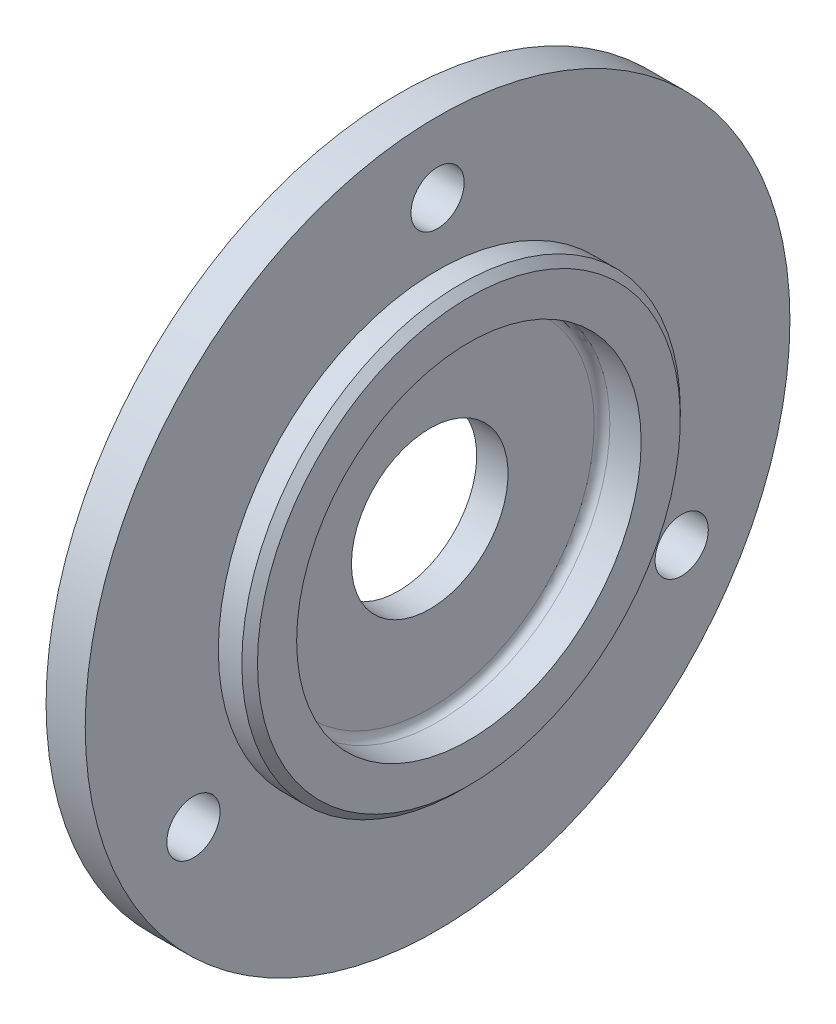
ISO-10303-21;
HEADER;
FILE_DESCRIPTION(('STEP AP214'),'2;1');
FILE_NAME('part.step','',(''),(''),'','','');
FILE_SCHEMA(('AUTOMOTIVE_DESIGN { 1 0 10303 214 1 1 1 1 }'));
ENDSEC;
DATA;
#1=APPLICATION_CONTEXT('core data for automotive mechanical design processes');
#2=APPLICATION_PROTOCOL_DEFINITION('international standard','automotive_design',2000,#1);
#3=PRODUCT_CONTEXT('',#1,'mechanical');
#4=PRODUCT('Part','Part','',(#3));
#5=PRODUCT_RELATED_PRODUCT_CATEGORY('part','',(#4));
#6=PRODUCT_DEFINITION_FORMATION('','',#4);
#7=PRODUCT_DEFINITION_CONTEXT('part definition',#1,'design');
#8=PRODUCT_DEFINITION('design','',#6,#7);
#9=PRODUCT_DEFINITION_SHAPE('','',#8);
#10=(LENGTH_UNIT() NAMED_UNIT(*) SI_UNIT(.MILLI.,.METRE.));
#11=(NAMED_UNIT(*) PLANE_ANGLE_UNIT() SI_UNIT($,.RADIAN.));
#12=(NAMED_UNIT(*) SI_UNIT($,.STERADIAN.) SOLID_ANGLE_UNIT());
#13=UNCERTAINTY_MEASURE_WITH_UNIT(LENGTH_MEASURE(1.E-05),#10,'distance_accuracy_value','');
#14=(GEOMETRIC_REPRESENTATION_CONTEXT(3) GLOBAL_UNCERTAINTY_ASSIGNED_CONTEXT((#13)) GLOBAL_UNIT_ASSIGNED_CONTEXT((#10,
#11,#12)) REPRESENTATION_CONTEXT('',''));
#15=CARTESIAN_POINT('',(0.,0.,0.));
#16=DIRECTION('',(0.,0.,1.));
#17=DIRECTION('',(1.,0.,0.));
#18=AXIS2_PLACEMENT_3D('',#15,#16,#17);
#19=CARTESIAN_POINT('',(-14.777796327212,-1.11022302462516E-13,0.));
#20=DIRECTION('',(-1.,0.,0.));
#21=DIRECTION('',(0.,0.,1.));
#22=AXIS2_PLACEMENT_3D('',#19,#20,#21);
#23=CYLINDRICAL_SURFACE('',#22,5.);
#24=CARTESIAN_POINT('',(-0.5,-1.11022302462516E-13,0.));
#25=DIRECTION('',(-1.,0.,0.));
#26=DIRECTION('',(0.,0.,1.));
#27=AXIS2_PLACEMENT_3D('',#24,#25,#26);
#28=CIRCLE('',#27,5.);
#29=CARTESIAN_POINT('',(-0.5,-1.11577413974828E-13,4.99999999999999));
#30=VERTEX_POINT('',#29);
#31=EDGE_CURVE('E66',#30,#30,#28,.T.);
#32=ORIENTED_EDGE('',*,*,#31,.F.);
#33=EDGE_LOOP('',(#32));
#34=FACE_BOUND('',#33,.T.);
#35=CARTESIAN_POINT('',(-2.5,-1.11022302462516E-13,0.));
#36=DIRECTION('',(-1.,0.,0.));
#37=DIRECTION('',(0.,0.,1.));
#38=AXIS2_PLACEMENT_3D('',#35,#36,#37);
#39=CIRCLE('',#38,5.);
#40=CARTESIAN_POINT('',(-2.5,-1.11577413974828E-13,4.99999999999999));
#41=VERTEX_POINT('',#40);
#42=EDGE_CURVE('E10',#41,#41,#39,.T.);
#43=ORIENTED_EDGE('',*,*,#42,.T.);
#44=EDGE_LOOP('',(#43));
#45=FACE_BOUND('',#44,.T.);
#46=ADVANCED_FACE('F32',(#34,#45),#23,.F.);
#47=CARTESIAN_POINT('',(-2.5,22.5,0.));
#48=DIRECTION('',(1.,0.,0.));
#49=DIRECTION('',(0.,0.,-1.));
#50=AXIS2_PLACEMENT_3D('',#47,#48,#49);
#51=PLANE('',#50);
#52=CARTESIAN_POINT('',(-2.5,-8.99999999999979,15.58845726812));
#53=DIRECTION('',(1.,0.,0.));
#54=DIRECTION('',(0.,0.,-1.));
#55=AXIS2_PLACEMENT_3D('',#52,#53,#54);
#56=CIRCLE('',#55,1.7);
#57=CARTESIAN_POINT('',(-2.5,-8.99999999999979,13.88845726812));
#58=VERTEX_POINT('',#57);
#59=EDGE_CURVE('E81',#58,#58,#56,.T.);
#60=ORIENTED_EDGE('',*,*,#59,.T.);
#61=EDGE_LOOP('',(#60));
#62=FACE_BOUND('',#61,.T.);
#63=CARTESIAN_POINT('',(-2.5,-9.00000000000001,-15.5884572681199));
#64=DIRECTION('',(1.,0.,0.));
#65=DIRECTION('',(0.,0.,-1.));
#66=AXIS2_PLACEMENT_3D('',#63,#64,#65);
#67=CIRCLE('',#66,1.7);
#68=CARTESIAN_POINT('',(-2.5,-9.00000000000001,-17.2884572681199));
#69=VERTEX_POINT('',#68);
#70=EDGE_CURVE('E75',#69,#69,#67,.T.);
#71=ORIENTED_EDGE('',*,*,#70,.T.);
#72=EDGE_LOOP('',(#71));
#73=FACE_BOUND('',#72,.T.);
#74=CARTESIAN_POINT('',(-2.5,18.,0.));
#75=DIRECTION('',(1.,0.,0.));
#76=DIRECTION('',(0.,0.,-1.));
#77=AXIS2_PLACEMENT_3D('',#74,#75,#76);
#78=CIRCLE('',#77,1.7);
#79=CARTESIAN_POINT('',(-2.5,18.,-1.70000000000003));
#80=VERTEX_POINT('',#79);
#81=EDGE_CURVE('E69',#80,#80,#78,.T.);
#82=ORIENTED_EDGE('',*,*,#81,.T.);
#83=EDGE_LOOP('',(#82));
#84=FACE_BOUND('',#83,.T.);
#85=ORIENTED_EDGE('',*,*,#42,.F.);
#86=EDGE_LOOP('',(#85));
#87=FACE_BOUND('',#86,.T.);
#88=CARTESIAN_POINT('',(-2.5,-1.11022302462516E-13,0.));
#89=DIRECTION('',(-1.,0.,0.));
#90=DIRECTION('',(0.,0.,1.));
#91=AXIS2_PLACEMENT_3D('',#88,#89,#90);
#92=CIRCLE('',#91,22.5);
#93=CARTESIAN_POINT('',(-2.5,-1.13520304267922E-13,22.5));
#94=VERTEX_POINT('',#93);
#95=EDGE_CURVE('E38',#94,#94,#92,.T.);
#96=ORIENTED_EDGE('',*,*,#95,.T.);
#97=EDGE_LOOP('',(#96));
#98=FACE_BOUND('',#97,.T.);
#99=ADVANCED_FACE('F142',(#62,#73,#84,#87,#98),#51,.F.);
#100=CARTESIAN_POINT('',(-14.777796327212,-1.11022302462516E-13,0.));
#101=DIRECTION('',(-1.,0.,0.));
#102=DIRECTION('',(0.,0.,1.));
#103=AXIS2_PLACEMENT_3D('',#100,#101,#102);
#104=CYLINDRICAL_SURFACE('',#103,22.5);
#105=ORIENTED_EDGE('',*,*,#95,.F.);
#106=EDGE_LOOP('',(#105));
#107=FACE_BOUND('',#106,.T.);
#108=CARTESIAN_POINT('',(0.,-1.11022302462516E-13,0.));
#109=DIRECTION('',(-1.,0.,0.));
#110=DIRECTION('',(0.,0.,1.));
#111=AXIS2_PLACEMENT_3D('',#108,#109,#110);
#112=CIRCLE('',#111,22.5);
#113=CARTESIAN_POINT('',(0.,-1.13520304267922E-13,22.5));
#114=VERTEX_POINT('',#113);
#115=EDGE_CURVE('E42',#114,#114,#112,.T.);
#116=ORIENTED_EDGE('',*,*,#115,.T.);
#117=EDGE_LOOP('',(#116));
#118=FACE_BOUND('',#117,.T.);
#119=ADVANCED_FACE('F95',(#107,#118),#104,.T.);
#120=CARTESIAN_POINT('',(0.,14.0000000000001,0.));
#121=DIRECTION('',(-1.,0.,0.));
#122=DIRECTION('',(0.,0.,1.));
#123=AXIS2_PLACEMENT_3D('',#120,#121,#122);
#124=PLANE('',#123);
#125=CARTESIAN_POINT('',(0.,-8.99999999999995,15.5884572681199));
#126=DIRECTION('',(1.,0.,0.));
#127=DIRECTION('',(0.,0.,-1.));
#128=AXIS2_PLACEMENT_3D('',#125,#126,#127);
#129=CIRCLE('',#128,1.7);
#130=CARTESIAN_POINT('',(0.,-8.99999999999995,13.8884572681199));
#131=VERTEX_POINT('',#130);
#132=EDGE_CURVE('E84',#131,#131,#129,.T.);
#133=ORIENTED_EDGE('',*,*,#132,.F.);
#134=EDGE_LOOP('',(#133));
#135=FACE_BOUND('',#134,.T.);
#136=CARTESIAN_POINT('',(0.,-9.00000000000001,-15.5884572681199));
#137=DIRECTION('',(1.,0.,0.));
#138=DIRECTION('',(0.,0.,-1.));
#139=AXIS2_PLACEMENT_3D('',#136,#137,#138);
#140=CIRCLE('',#139,1.7);
#141=CARTESIAN_POINT('',(0.,-9.00000000000001,-17.2884572681199));
#142=VERTEX_POINT('',#141);
#143=EDGE_CURVE('E78',#142,#142,#140,.T.);
#144=ORIENTED_EDGE('',*,*,#143,.F.);
#145=EDGE_LOOP('',(#144));
#146=FACE_BOUND('',#145,.T.);
#147=CARTESIAN_POINT('',(0.,18.,0.));
#148=DIRECTION('',(1.,0.,0.));
#149=DIRECTION('',(0.,0.,-1.));
#150=AXIS2_PLACEMENT_3D('',#147,#148,#149);
#151=CIRCLE('',#150,1.7);
#152=CARTESIAN_POINT('',(0.,18.,-1.70000000000003));
#153=VERTEX_POINT('',#152);
#154=EDGE_CURVE('E72',#153,#153,#151,.T.);
#155=ORIENTED_EDGE('',*,*,#154,.F.);
#156=EDGE_LOOP('',(#155));
#157=FACE_BOUND('',#156,.T.);
#158=ORIENTED_EDGE('',*,*,#115,.F.);
#159=EDGE_LOOP('',(#158));
#160=FACE_BOUND('',#159,.T.);
#161=CARTESIAN_POINT('',(0.,-1.11022302462516E-13,0.));
#162=DIRECTION('',(-1.,0.,0.));
#163=DIRECTION('',(0.,0.,1.));
#164=AXIS2_PLACEMENT_3D('',#161,#162,#163);
#165=CIRCLE('',#164,14.);
#166=CARTESIAN_POINT('',(0.,-1.12576614696991E-13,14.));
#167=VERTEX_POINT('',#166);
#168=EDGE_CURVE('E46',#167,#167,#165,.T.);
#169=ORIENTED_EDGE('',*,*,#168,.T.);
#170=EDGE_LOOP('',(#169));
#171=FACE_BOUND('',#170,.T.);
#172=ADVANCED_FACE('F91',(#135,#146,#157,#160,#171),#124,.F.);
#173=CARTESIAN_POINT('',(-14.777796327212,-1.11022302462516E-13,0.));
#174=DIRECTION('',(-1.,0.,0.));
#175=DIRECTION('',(0.,0.,1.));
#176=AXIS2_PLACEMENT_3D('',#173,#174,#175);
#177=CYLINDRICAL_SURFACE('',#176,14.);
#178=ORIENTED_EDGE('',*,*,#168,.F.);
#179=EDGE_LOOP('',(#178));
#180=FACE_BOUND('',#179,.T.);
#181=CARTESIAN_POINT('',(1.5,-1.11022302462516E-13,0.));
#182=DIRECTION('',(-1.,0.,0.));
#183=DIRECTION('',(0.,0.,1.));
#184=AXIS2_PLACEMENT_3D('',#181,#182,#183);
#185=CIRCLE('',#184,14.);
#186=CARTESIAN_POINT('',(1.5,-1.12576614696991E-13,14.));
#187=VERTEX_POINT('',#186);
#188=EDGE_CURVE('E51',#187,#187,#185,.T.);
#189=ORIENTED_EDGE('',*,*,#188,.T.);
#190=EDGE_LOOP('',(#189));
#191=FACE_BOUND('',#190,.T.);
#192=ADVANCED_FACE('F94',(#180,#191),#177,.T.);
#193=CARTESIAN_POINT('',(2.,-1.11022302462516E-13,0.));
#194=DIRECTION('',(-1.,0.,0.));
#195=DIRECTION('',(0.,0.,1.));
#196=AXIS2_PLACEMENT_3D('',#193,#194,#195);
#197=CONICAL_SURFACE('',#196,13.5,0.785398163397447);
#198=ORIENTED_EDGE('',*,*,#188,.F.);
#199=EDGE_LOOP('',(#198));
#200=FACE_BOUND('',#199,.T.);
#201=CARTESIAN_POINT('',(2.,-1.11022302462516E-13,0.));
#202=DIRECTION('',(-1.,0.,0.));
#203=DIRECTION('',(0.,0.,1.));
#204=AXIS2_PLACEMENT_3D('',#201,#202,#203);
#205=CIRCLE('',#204,13.5);
#206=CARTESIAN_POINT('',(2.,-1.1252110354576E-13,13.5));
#207=VERTEX_POINT('',#206);
#208=EDGE_CURVE('E54',#207,#207,#205,.T.);
#209=ORIENTED_EDGE('',*,*,#208,.T.);
#210=EDGE_LOOP('',(#209));
#211=FACE_BOUND('',#210,.T.);
#212=ADVANCED_FACE('F107',(#200,#211),#197,.T.);
#213=CARTESIAN_POINT('',(2.,11.,0.));
#214=DIRECTION('',(-1.,0.,0.));
#215=DIRECTION('',(0.,0.,1.));
#216=AXIS2_PLACEMENT_3D('',#213,#214,#215);
#217=PLANE('',#216);
#218=ORIENTED_EDGE('',*,*,#208,.F.);
#219=EDGE_LOOP('',(#218));
#220=FACE_BOUND('',#219,.T.);
#221=CARTESIAN_POINT('',(2.,-1.11022302462516E-13,0.));
#222=DIRECTION('',(-1.,0.,0.));
#223=DIRECTION('',(0.,0.,1.));
#224=AXIS2_PLACEMENT_3D('',#221,#222,#223);
#225=CIRCLE('',#224,11.);
#226=CARTESIAN_POINT('',(2.,-1.12243547789603E-13,11.));
#227=VERTEX_POINT('',#226);
#228=EDGE_CURVE('E57',#227,#227,#225,.T.);
#229=ORIENTED_EDGE('',*,*,#228,.T.);
#230=EDGE_LOOP('',(#229));
#231=FACE_BOUND('',#230,.T.);
#232=ADVANCED_FACE('F113',(#220,#231),#217,.F.);
#233=CARTESIAN_POINT('',(-14.777796327212,-1.11022302462516E-13,0.));
#234=DIRECTION('',(-1.,0.,0.));
#235=DIRECTION('',(0.,0.,1.));
#236=AXIS2_PLACEMENT_3D('',#233,#234,#235);
#237=CYLINDRICAL_SURFACE('',#236,11.);
#238=ORIENTED_EDGE('',*,*,#228,.F.);
#239=EDGE_LOOP('',(#238));
#240=FACE_BOUND('',#239,.T.);
#241=CARTESIAN_POINT('',(0.,-1.11022302462516E-13,0.));
#242=DIRECTION('',(-1.,0.,0.));
#243=DIRECTION('',(0.,0.,1.));
#244=AXIS2_PLACEMENT_3D('',#241,#242,#243);
#245=CIRCLE('',#244,11.);
#246=CARTESIAN_POINT('',(0.,-1.12243547789603E-13,11.));
#247=VERTEX_POINT('',#246);
#248=EDGE_CURVE('E60',#247,#247,#245,.T.);
#249=ORIENTED_EDGE('',*,*,#248,.T.);
#250=EDGE_LOOP('',(#249));
#251=FACE_BOUND('',#250,.T.);
#252=ADVANCED_FACE('F119',(#240,#251),#237,.F.);
#253=CARTESIAN_POINT('',(0.,-1.11022302462516E-13,0.));
#254=DIRECTION('',(-1.,0.,0.));
#255=DIRECTION('',(0.,0.,1.));
#256=AXIS2_PLACEMENT_3D('',#253,#254,#255);
#257=TOROIDAL_SURFACE('',#256,10.5,0.5);
#258=ORIENTED_EDGE('',*,*,#248,.F.);
#259=EDGE_LOOP('',(#258));
#260=FACE_BOUND('',#259,.T.);
#261=CARTESIAN_POINT('',(-0.5,-1.11022302462516E-13,0.));
#262=DIRECTION('',(-1.,0.,0.));
#263=DIRECTION('',(0.,0.,1.));
#264=AXIS2_PLACEMENT_3D('',#261,#262,#263);
#265=CIRCLE('',#264,10.5);
#266=CARTESIAN_POINT('',(-0.5,-1.12188036638372E-13,10.5));
#267=VERTEX_POINT('',#266);
#268=EDGE_CURVE('E63',#267,#267,#265,.T.);
#269=ORIENTED_EDGE('',*,*,#268,.T.);
#270=EDGE_LOOP('',(#269));
#271=FACE_BOUND('',#270,.T.);
#272=ADVANCED_FACE('F125',(#260,#271),#257,.F.);
#273=CARTESIAN_POINT('',(-0.500000000000002,5.00000000000014,0.));
#274=DIRECTION('',(-1.,0.,0.));
#275=DIRECTION('',(0.,0.,1.));
#276=AXIS2_PLACEMENT_3D('',#273,#274,#275);
#277=PLANE('',#276);
#278=ORIENTED_EDGE('',*,*,#268,.F.);
#279=EDGE_LOOP('',(#278));
#280=FACE_BOUND('',#279,.T.);
#281=ORIENTED_EDGE('',*,*,#31,.T.);
#282=EDGE_LOOP('',(#281));
#283=FACE_BOUND('',#282,.T.);
#284=ADVANCED_FACE('F131',(#280,#283),#277,.F.);
#285=CARTESIAN_POINT('',(-9.99999999999998,18.,0.));
#286=DIRECTION('',(1.,0.,0.));
#287=DIRECTION('',(0.,0.,-1.));
#288=AXIS2_PLACEMENT_3D('',#285,#286,#287);
#289=CYLINDRICAL_SURFACE('',#288,1.7);
#290=ORIENTED_EDGE('',*,*,#154,.T.);
#291=EDGE_LOOP('',(#290));
#292=FACE_BOUND('',#291,.T.);
#293=ORIENTED_EDGE('',*,*,#81,.F.);
#294=EDGE_LOOP('',(#293));
#295=FACE_BOUND('',#294,.T.);
#296=ADVANCED_FACE('F137',(#292,#295),#289,.F.);
#297=CARTESIAN_POINT('',(-10.,-9.00000000000006,-15.5884572681199));
#298=DIRECTION('',(1.,0.,0.));
#299=DIRECTION('',(0.,0.,-1.));
#300=AXIS2_PLACEMENT_3D('',#297,#298,#299);
#301=CYLINDRICAL_SURFACE('',#300,1.7);
#302=ORIENTED_EDGE('',*,*,#143,.T.);
#303=EDGE_LOOP('',(#302));
#304=FACE_BOUND('',#303,.T.);
#305=ORIENTED_EDGE('',*,*,#70,.F.);
#306=EDGE_LOOP('',(#305));
#307=FACE_BOUND('',#306,.T.);
#308=ADVANCED_FACE('F156',(#304,#307),#301,.F.);
#309=CARTESIAN_POINT('',(-9.99999999999998,-8.99999999999979,15.58845726812));
#310=DIRECTION('',(1.,0.,0.));
#311=DIRECTION('',(0.,0.,-1.));
#312=AXIS2_PLACEMENT_3D('',#309,#310,#311);
#313=CYLINDRICAL_SURFACE('',#312,1.7);
#314=ORIENTED_EDGE('',*,*,#132,.T.);
#315=EDGE_LOOP('',(#314));
#316=FACE_BOUND('',#315,.T.);
#317=ORIENTED_EDGE('',*,*,#59,.F.);
#318=EDGE_LOOP('',(#317));
#319=FACE_BOUND('',#318,.T.);
#320=ADVANCED_FACE('F88',(#316,#319),#313,.F.);
#321=CLOSED_SHELL('',(#46,#99,#119,#172,#192,#212,#232,#252,#272,#284,#296,#308,#320));
#322=MANIFOLD_SOLID_BREP('B2',#321);
#323=ADVANCED_BREP_SHAPE_REPRESENTATION('',(#18,#322),#14);
#324=SHAPE_DEFINITION_REPRESENTATION(#9,#323);
ENDSEC;
END-ISO-10303-21;
